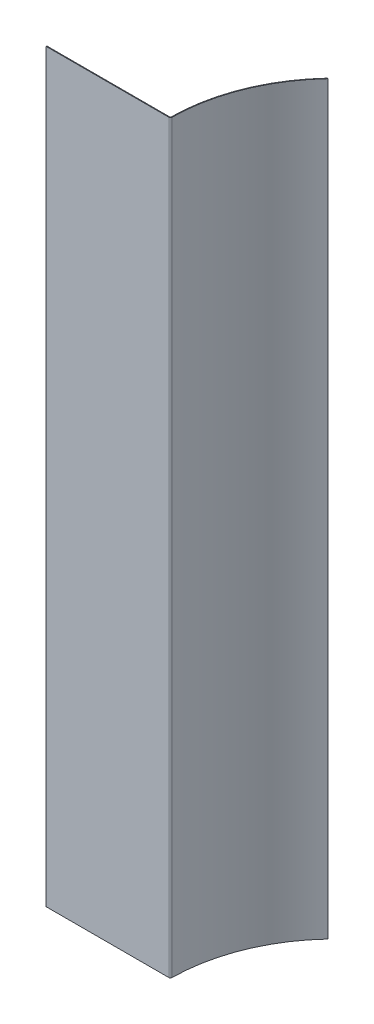
ISO-10303-21;
HEADER;
FILE_DESCRIPTION(('STEP AP214'),'2;1');
FILE_NAME('part.step','',(''),(''),'','','');
FILE_SCHEMA(('AUTOMOTIVE_DESIGN { 1 0 10303 214 1 1 1 1 }'));
ENDSEC;
DATA;
#1=APPLICATION_CONTEXT('core data for automotive mechanical design processes');
#2=APPLICATION_PROTOCOL_DEFINITION('international standard','automotive_design',2000,#1);
#3=PRODUCT_CONTEXT('',#1,'mechanical');
#4=PRODUCT('Part','Part','',(#3));
#5=PRODUCT_RELATED_PRODUCT_CATEGORY('part','',(#4));
#6=PRODUCT_DEFINITION_FORMATION('','',#4);
#7=PRODUCT_DEFINITION_CONTEXT('part definition',#1,'design');
#8=PRODUCT_DEFINITION('design','',#6,#7);
#9=PRODUCT_DEFINITION_SHAPE('','',#8);
#10=(LENGTH_UNIT() NAMED_UNIT(*) SI_UNIT(.MILLI.,.METRE.));
#11=(NAMED_UNIT(*) PLANE_ANGLE_UNIT() SI_UNIT($,.RADIAN.));
#12=(NAMED_UNIT(*) SI_UNIT($,.STERADIAN.) SOLID_ANGLE_UNIT());
#13=UNCERTAINTY_MEASURE_WITH_UNIT(LENGTH_MEASURE(1.E-05),#10,'distance_accuracy_value','');
#14=(GEOMETRIC_REPRESENTATION_CONTEXT(3) GLOBAL_UNCERTAINTY_ASSIGNED_CONTEXT((#13)) GLOBAL_UNIT_ASSIGNED_CONTEXT((#10,
#11,#12)) REPRESENTATION_CONTEXT('',''));
#15=CARTESIAN_POINT('',(0.,0.,0.));
#16=DIRECTION('',(0.,0.,1.));
#17=DIRECTION('',(1.,0.,0.));
#18=AXIS2_PLACEMENT_3D('',#15,#16,#17);
#19=CARTESIAN_POINT('',(-170.378922722289,762.,0.));
#20=DIRECTION('',(0.,1.,0.));
#21=DIRECTION('',(0.,0.,1.));
#22=AXIS2_PLACEMENT_3D('',#19,#20,#21);
#23=PLANE('',#22);
#24=DIRECTION('',(0.,0.,-1.));
#25=VECTOR('',#24,1.);
#26=CARTESIAN_POINT('',(-170.378922722289,762.,0.));
#27=LINE('',#26,#25);
#28=CARTESIAN_POINT('',(-170.378922722289,762.,0.));
#29=VERTEX_POINT('',#28);
#30=CARTESIAN_POINT('',(-170.378922722289,762.,-0.736599999999979));
#31=VERTEX_POINT('',#30);
#32=EDGE_CURVE('E11',#29,#31,#27,.T.);
#33=ORIENTED_EDGE('',*,*,#32,.F.);
#34=CARTESIAN_POINT('',(-170.378922722289,762.,-1.47319999999998));
#35=DIRECTION('',(0.,1.,0.));
#36=DIRECTION('',(0.,0.,1.));
#37=AXIS2_PLACEMENT_3D('',#34,#35,#36);
#38=CIRCLE('',#37,1.4732);
#39=CARTESIAN_POINT('',(-168.905777790256,762.,-1.46046229113791));
#40=VERTEX_POINT('',#39);
#41=EDGE_CURVE('E133',#40,#29,#38,.F.);
#42=ORIENTED_EDGE('',*,*,#41,.F.);
#43=DIRECTION('',(0.999962620168659,0.,0.00864628622187965));
#44=VECTOR('',#43,1.);
#45=CARTESIAN_POINT('',(-169.642350256272,762.,-1.46683114556894));
#46=LINE('',#45,#44);
#47=CARTESIAN_POINT('',(-169.642350256272,762.,-1.46683114556894));
#48=VERTEX_POINT('',#47);
#49=EDGE_CURVE('E44',#48,#40,#46,.T.);
#50=ORIENTED_EDGE('',*,*,#49,.F.);
#51=CARTESIAN_POINT('',(-170.378922722289,762.,-1.47319999999998));
#52=DIRECTION('',(0.,1.,0.));
#53=DIRECTION('',(1.,0.,0.));
#54=AXIS2_PLACEMENT_3D('',#51,#52,#53);
#55=CIRCLE('',#54,0.7366);
#56=EDGE_CURVE('E126',#48,#31,#55,.F.);
#57=ORIENTED_EDGE('',*,*,#56,.T.);
#58=EDGE_LOOP('',(#33,#42,#50,#57));
#59=FACE_BOUND('',#58,.T.);
#60=ADVANCED_FACE('F36',(#59),#23,.T.);
#61=CARTESIAN_POINT('',(-169.642350256272,762.,-1.46683114556894));
#62=DIRECTION('',(0.,1.,0.));
#63=DIRECTION('',(0.,0.,1.));
#64=AXIS2_PLACEMENT_3D('',#61,#62,#63);
#65=PLANE('',#64);
#66=DIRECTION('',(-1.,0.,0.));
#67=VECTOR('',#66,1.);
#68=CARTESIAN_POINT('',(-168.912091695755,762.,0.));
#69=LINE('',#68,#67);
#70=CARTESIAN_POINT('',(-295.912091695755,762.,0.));
#71=VERTEX_POINT('',#70);
#72=EDGE_CURVE('E182',#29,#71,#69,.T.);
#73=ORIENTED_EDGE('',*,*,#72,.F.);
#74=ORIENTED_EDGE('',*,*,#32,.T.);
#75=DIRECTION('',(-1.,0.,0.));
#76=VECTOR('',#75,1.);
#77=CARTESIAN_POINT('',(-168.912091695755,762.,-0.736599999999979));
#78=LINE('',#77,#76);
#79=CARTESIAN_POINT('',(-295.912091695755,762.,-0.736599999999964));
#80=VERTEX_POINT('',#79);
#81=EDGE_CURVE('E92',#31,#80,#78,.T.);
#82=ORIENTED_EDGE('',*,*,#81,.T.);
#83=DIRECTION('',(0.,0.,-1.));
#84=VECTOR('',#83,1.);
#85=CARTESIAN_POINT('',(-295.912091695755,762.,0.));
#86=LINE('',#85,#84);
#87=EDGE_CURVE('E339',#71,#80,#86,.T.);
#88=ORIENTED_EDGE('',*,*,#87,.F.);
#89=EDGE_LOOP('',(#73,#74,#82,#88));
#90=FACE_BOUND('',#89,.T.);
#91=ADVANCED_FACE('F190',(#90),#65,.T.);
#92=CARTESIAN_POINT('',(-168.905777790256,0.,-1.46046229113791));
#93=DIRECTION('',(0.,-1.,0.));
#94=DIRECTION('',(0.,0.,-1.));
#95=AXIS2_PLACEMENT_3D('',#92,#93,#94);
#96=PLANE('',#95);
#97=DIRECTION('',(-0.999962620168659,0.,-0.00864628622187965));
#98=VECTOR('',#97,1.);
#99=CARTESIAN_POINT('',(-168.905777790256,0.,-1.46046229113791));
#100=LINE('',#99,#98);
#101=CARTESIAN_POINT('',(-168.905777790256,0.,-1.46046229113791));
#102=VERTEX_POINT('',#101);
#103=CARTESIAN_POINT('',(-169.642350256272,0.,-1.46683114556894));
#104=VERTEX_POINT('',#103);
#105=EDGE_CURVE('E79',#102,#104,#100,.T.);
#106=ORIENTED_EDGE('',*,*,#105,.F.);
#107=CARTESIAN_POINT('',(-170.378922722289,0.,-1.47319999999998));
#108=DIRECTION('',(0.,1.,0.));
#109=DIRECTION('',(0.,0.,1.));
#110=AXIS2_PLACEMENT_3D('',#107,#108,#109);
#111=CIRCLE('',#110,1.4732);
#112=CARTESIAN_POINT('',(-170.378922722289,0.,0.));
#113=VERTEX_POINT('',#112);
#114=EDGE_CURVE('E148',#102,#113,#111,.F.);
#115=ORIENTED_EDGE('',*,*,#114,.T.);
#116=DIRECTION('',(0.,0.,1.));
#117=VECTOR('',#116,1.);
#118=CARTESIAN_POINT('',(-170.378922722289,0.,-0.736599999999979));
#119=LINE('',#118,#117);
#120=CARTESIAN_POINT('',(-170.378922722289,0.,-0.736599999999979));
#121=VERTEX_POINT('',#120);
#122=EDGE_CURVE('E86',#121,#113,#119,.T.);
#123=ORIENTED_EDGE('',*,*,#122,.F.);
#124=CARTESIAN_POINT('',(-170.378922722289,0.,-1.47319999999998));
#125=DIRECTION('',(0.,1.,0.));
#126=DIRECTION('',(1.,0.,0.));
#127=AXIS2_PLACEMENT_3D('',#124,#125,#126);
#128=CIRCLE('',#127,0.7366);
#129=EDGE_CURVE('E155',#104,#121,#128,.F.);
#130=ORIENTED_EDGE('',*,*,#129,.F.);
#131=EDGE_LOOP('',(#106,#115,#123,#130));
#132=FACE_BOUND('',#131,.T.);
#133=ADVANCED_FACE('F188',(#132),#96,.T.);
#134=CARTESIAN_POINT('',(-170.378922722289,0.,-0.736599999999979));
#135=DIRECTION('',(0.,-1.,0.));
#136=DIRECTION('',(0.,0.,-1.));
#137=AXIS2_PLACEMENT_3D('',#134,#135,#136);
#138=PLANE('',#137);
#139=CARTESIAN_POINT('',(0.,0.,0.));
#140=DIRECTION('',(0.,1.,0.));
#141=DIRECTION('',(0.,0.,-1.));
#142=AXIS2_PLACEMENT_3D('',#139,#140,#141);
#143=CIRCLE('',#142,168.912091695755);
#144=CARTESIAN_POINT('',(-123.375530284328,0.,-115.367990569725));
#145=VERTEX_POINT('',#144);
#146=EDGE_CURVE('E150',#145,#102,#143,.T.);
#147=ORIENTED_EDGE('',*,*,#146,.T.);
#148=ORIENTED_EDGE('',*,*,#105,.T.);
#149=CARTESIAN_POINT('',(0.,0.,0.));
#150=DIRECTION('',(0.,1.,0.));
#151=DIRECTION('',(1.,0.,0.));
#152=AXIS2_PLACEMENT_3D('',#149,#150,#151);
#153=CIRCLE('',#152,169.648691695755);
#154=CARTESIAN_POINT('',(-123.913552250044,0.,-115.871092869865));
#155=VERTEX_POINT('',#154);
#156=EDGE_CURVE('E153',#155,#104,#153,.T.);
#157=ORIENTED_EDGE('',*,*,#156,.F.);
#158=DIRECTION('',(0.730412660489435,0.,0.683006109340719));
#159=VECTOR('',#158,1.);
#160=CARTESIAN_POINT('',(-123.913552250044,0.,-115.871092869865));
#161=LINE('',#160,#159);
#162=EDGE_CURVE('E114',#155,#145,#161,.T.);
#163=ORIENTED_EDGE('',*,*,#162,.T.);
#164=EDGE_LOOP('',(#147,#148,#157,#163));
#165=FACE_BOUND('',#164,.T.);
#166=ADVANCED_FACE('F184',(#165),#138,.T.);
#167=CARTESIAN_POINT('',(-168.912091695755,762.,-0.736599999999979));
#168=DIRECTION('',(0.,0.,1.));
#169=DIRECTION('',(1.,0.,0.));
#170=AXIS2_PLACEMENT_3D('',#167,#168,#169);
#171=PLANE('',#170);
#172=DIRECTION('',(-1.,0.,0.));
#173=VECTOR('',#172,1.);
#174=CARTESIAN_POINT('',(-168.912091695755,0.,-0.736599999999979));
#175=LINE('',#174,#173);
#176=CARTESIAN_POINT('',(-295.912091695755,0.,-0.736599999999964));
#177=VERTEX_POINT('',#176);
#178=EDGE_CURVE('E139',#121,#177,#175,.T.);
#179=ORIENTED_EDGE('',*,*,#178,.T.);
#180=DIRECTION('',(0.,-1.,0.));
#181=VECTOR('',#180,1.);
#182=CARTESIAN_POINT('',(-295.912091695755,762.,-0.736599999999964));
#183=LINE('',#182,#181);
#184=EDGE_CURVE('E169',#80,#177,#183,.T.);
#185=ORIENTED_EDGE('',*,*,#184,.F.);
#186=ORIENTED_EDGE('',*,*,#81,.F.);
#187=DIRECTION('',(0.,-1.,0.));
#188=VECTOR('',#187,1.);
#189=CARTESIAN_POINT('',(-170.378922722289,762.,-0.736599999999979));
#190=LINE('',#189,#188);
#191=EDGE_CURVE('E138',#31,#121,#190,.T.);
#192=ORIENTED_EDGE('',*,*,#191,.T.);
#193=EDGE_LOOP('',(#179,#185,#186,#192));
#194=FACE_BOUND('',#193,.T.);
#195=ADVANCED_FACE('F196',(#194),#171,.F.);
#196=CARTESIAN_POINT('',(-295.912091695755,762.,0.));
#197=DIRECTION('',(-1.,0.,0.));
#198=DIRECTION('',(0.,0.,1.));
#199=AXIS2_PLACEMENT_3D('',#196,#197,#198);
#200=PLANE('',#199);
#201=DIRECTION('',(0.,0.,-1.));
#202=VECTOR('',#201,1.);
#203=CARTESIAN_POINT('',(-295.912091695755,0.,0.));
#204=LINE('',#203,#202);
#205=CARTESIAN_POINT('',(-295.912091695755,0.,0.));
#206=VERTEX_POINT('',#205);
#207=EDGE_CURVE('E142',#206,#177,#204,.T.);
#208=ORIENTED_EDGE('',*,*,#207,.F.);
#209=DIRECTION('',(0.,-1.,0.));
#210=VECTOR('',#209,1.);
#211=CARTESIAN_POINT('',(-295.912091695755,762.,0.));
#212=LINE('',#211,#210);
#213=EDGE_CURVE('E167',#71,#206,#212,.T.);
#214=ORIENTED_EDGE('',*,*,#213,.F.);
#215=ORIENTED_EDGE('',*,*,#87,.T.);
#216=ORIENTED_EDGE('',*,*,#184,.T.);
#217=EDGE_LOOP('',(#208,#214,#215,#216));
#218=FACE_BOUND('',#217,.T.);
#219=ADVANCED_FACE('F227',(#218),#200,.T.);
#220=CARTESIAN_POINT('',(-168.912091695755,762.,0.));
#221=DIRECTION('',(0.,0.,1.));
#222=DIRECTION('',(1.,0.,0.));
#223=AXIS2_PLACEMENT_3D('',#220,#221,#222);
#224=PLANE('',#223);
#225=DIRECTION('',(-1.,0.,0.));
#226=VECTOR('',#225,1.);
#227=CARTESIAN_POINT('',(-168.912091695755,0.,0.));
#228=LINE('',#227,#226);
#229=EDGE_CURVE('E145',#113,#206,#228,.T.);
#230=ORIENTED_EDGE('',*,*,#229,.F.);
#231=DIRECTION('',(0.,-1.,0.));
#232=VECTOR('',#231,1.);
#233=CARTESIAN_POINT('',(-170.378922722289,762.,0.));
#234=LINE('',#233,#232);
#235=EDGE_CURVE('E164',#29,#113,#234,.T.);
#236=ORIENTED_EDGE('',*,*,#235,.F.);
#237=ORIENTED_EDGE('',*,*,#72,.T.);
#238=ORIENTED_EDGE('',*,*,#213,.T.);
#239=EDGE_LOOP('',(#230,#236,#237,#238));
#240=FACE_BOUND('',#239,.T.);
#241=ADVANCED_FACE('F238',(#240),#224,.T.);
#242=CARTESIAN_POINT('',(-170.378922722289,762.,-1.47319999999998));
#243=DIRECTION('',(0.,-1.,0.));
#244=DIRECTION('',(0.,0.,-1.));
#245=AXIS2_PLACEMENT_3D('',#242,#243,#244);
#246=CYLINDRICAL_SURFACE('',#245,1.4732);
#247=ORIENTED_EDGE('',*,*,#114,.F.);
#248=DIRECTION('',(0.,-1.,0.));
#249=VECTOR('',#248,1.);
#250=CARTESIAN_POINT('',(-168.905777790256,762.,-1.46046229113791));
#251=LINE('',#250,#249);
#252=EDGE_CURVE('E161',#40,#102,#251,.T.);
#253=ORIENTED_EDGE('',*,*,#252,.F.);
#254=ORIENTED_EDGE('',*,*,#41,.T.);
#255=ORIENTED_EDGE('',*,*,#235,.T.);
#256=EDGE_LOOP('',(#247,#253,#254,#255));
#257=FACE_BOUND('',#256,.T.);
#258=ADVANCED_FACE('F178',(#257),#246,.T.);
#259=CARTESIAN_POINT('',(0.,762.,0.));
#260=DIRECTION('',(0.,-1.,0.));
#261=DIRECTION('',(0.,0.,-1.));
#262=AXIS2_PLACEMENT_3D('',#259,#260,#261);
#263=CYLINDRICAL_SURFACE('',#262,168.912091695755);
#264=ORIENTED_EDGE('',*,*,#146,.F.);
#265=DIRECTION('',(0.,-1.,0.));
#266=VECTOR('',#265,1.);
#267=CARTESIAN_POINT('',(-123.375530284328,762.,-115.367990569725));
#268=LINE('',#267,#266);
#269=CARTESIAN_POINT('',(-123.375530284328,762.,-115.367990569725));
#270=VERTEX_POINT('',#269);
#271=EDGE_CURVE('E116',#270,#145,#268,.T.);
#272=ORIENTED_EDGE('',*,*,#271,.F.);
#273=CARTESIAN_POINT('',(0.,762.,0.));
#274=DIRECTION('',(0.,1.,0.));
#275=DIRECTION('',(0.,0.,-1.));
#276=AXIS2_PLACEMENT_3D('',#273,#274,#275);
#277=CIRCLE('',#276,168.912091695755);
#278=EDGE_CURVE('E131',#270,#40,#277,.T.);
#279=ORIENTED_EDGE('',*,*,#278,.T.);
#280=ORIENTED_EDGE('',*,*,#252,.T.);
#281=EDGE_LOOP('',(#264,#272,#279,#280));
#282=FACE_BOUND('',#281,.T.);
#283=ADVANCED_FACE('F183',(#282),#263,.F.);
#284=CARTESIAN_POINT('',(-123.913552250044,762.,-115.871092869865));
#285=DIRECTION('',(0.683006109340719,0.,-0.730412660489435));
#286=DIRECTION('',(-0.730412660489435,0.,-0.683006109340719));
#287=AXIS2_PLACEMENT_3D('',#284,#285,#286);
#288=PLANE('',#287);
#289=ORIENTED_EDGE('',*,*,#162,.F.);
#290=DIRECTION('',(0.,-1.,0.));
#291=VECTOR('',#290,1.);
#292=CARTESIAN_POINT('',(-123.913552250044,762.,-115.871092869865));
#293=LINE('',#292,#291);
#294=CARTESIAN_POINT('',(-123.913552250044,762.,-115.871092869865));
#295=VERTEX_POINT('',#294);
#296=EDGE_CURVE('E108',#295,#155,#293,.T.);
#297=ORIENTED_EDGE('',*,*,#296,.F.);
#298=DIRECTION('',(0.730412660489435,0.,0.683006109340719));
#299=VECTOR('',#298,1.);
#300=CARTESIAN_POINT('',(-123.913552250044,762.,-115.871092869865));
#301=LINE('',#300,#299);
#302=EDGE_CURVE('E112',#295,#270,#301,.T.);
#303=ORIENTED_EDGE('',*,*,#302,.T.);
#304=ORIENTED_EDGE('',*,*,#271,.T.);
#305=EDGE_LOOP('',(#289,#297,#303,#304));
#306=FACE_BOUND('',#305,.T.);
#307=ADVANCED_FACE('F110',(#306),#288,.T.);
#308=CARTESIAN_POINT('',(0.,762.,0.));
#309=DIRECTION('',(0.,-1.,0.));
#310=DIRECTION('',(0.,0.,-1.));
#311=AXIS2_PLACEMENT_3D('',#308,#309,#310);
#312=CYLINDRICAL_SURFACE('',#311,169.648691695755);
#313=ORIENTED_EDGE('',*,*,#156,.T.);
#314=DIRECTION('',(0.,-1.,0.));
#315=VECTOR('',#314,1.);
#316=CARTESIAN_POINT('',(-169.642350256272,762.,-1.46683114556894));
#317=LINE('',#316,#315);
#318=EDGE_CURVE('E117',#48,#104,#317,.T.);
#319=ORIENTED_EDGE('',*,*,#318,.F.);
#320=CARTESIAN_POINT('',(0.,762.,0.));
#321=DIRECTION('',(0.,1.,0.));
#322=DIRECTION('',(1.,0.,0.));
#323=AXIS2_PLACEMENT_3D('',#320,#321,#322);
#324=CIRCLE('',#323,169.648691695755);
#325=EDGE_CURVE('E121',#295,#48,#324,.T.);
#326=ORIENTED_EDGE('',*,*,#325,.F.);
#327=ORIENTED_EDGE('',*,*,#296,.T.);
#328=EDGE_LOOP('',(#313,#319,#326,#327));
#329=FACE_BOUND('',#328,.T.);
#330=ADVANCED_FACE('F122',(#329),#312,.T.);
#331=CARTESIAN_POINT('',(-170.378922722289,762.,-1.47319999999998));
#332=DIRECTION('',(0.,-1.,0.));
#333=DIRECTION('',(0.,0.,-1.));
#334=AXIS2_PLACEMENT_3D('',#331,#332,#333);
#335=CYLINDRICAL_SURFACE('',#334,0.7366);
#336=ORIENTED_EDGE('',*,*,#129,.T.);
#337=ORIENTED_EDGE('',*,*,#191,.F.);
#338=ORIENTED_EDGE('',*,*,#56,.F.);
#339=ORIENTED_EDGE('',*,*,#318,.T.);
#340=EDGE_LOOP('',(#336,#337,#338,#339));
#341=FACE_BOUND('',#340,.T.);
#342=ADVANCED_FACE('F186',(#341),#335,.F.);
#343=CARTESIAN_POINT('',(-170.378922722289,762.,-1.47319999999998));
#344=DIRECTION('',(0.,1.,0.));
#345=DIRECTION('',(1.,0.,0.));
#346=AXIS2_PLACEMENT_3D('',#343,#344,#345);
#347=PLANE('',#346);
#348=ORIENTED_EDGE('',*,*,#325,.T.);
#349=ORIENTED_EDGE('',*,*,#49,.T.);
#350=ORIENTED_EDGE('',*,*,#278,.F.);
#351=ORIENTED_EDGE('',*,*,#302,.F.);
#352=EDGE_LOOP('',(#348,#349,#350,#351));
#353=FACE_BOUND('',#352,.T.);
#354=ADVANCED_FACE('F129',(#353),#347,.T.);
#355=CARTESIAN_POINT('',(-170.378922722289,0.,-1.47319999999998));
#356=DIRECTION('',(0.,1.,0.));
#357=DIRECTION('',(1.,0.,0.));
#358=AXIS2_PLACEMENT_3D('',#355,#356,#357);
#359=PLANE('',#358);
#360=ORIENTED_EDGE('',*,*,#178,.F.);
#361=ORIENTED_EDGE('',*,*,#122,.T.);
#362=ORIENTED_EDGE('',*,*,#229,.T.);
#363=ORIENTED_EDGE('',*,*,#207,.T.);
#364=EDGE_LOOP('',(#360,#361,#362,#363));
#365=FACE_BOUND('',#364,.T.);
#366=ADVANCED_FACE('F304',(#365),#359,.F.);
#367=CLOSED_SHELL('',(#60,#91,#133,#166,#195,#219,#241,#258,#283,#307,#330,#342,#354,#366));
#368=MANIFOLD_SOLID_BREP('B2',#367);
#369=ADVANCED_BREP_SHAPE_REPRESENTATION('',(#18,#368),#14);
#370=SHAPE_DEFINITION_REPRESENTATION(#9,#369);
ENDSEC;
END-ISO-10303-21;
